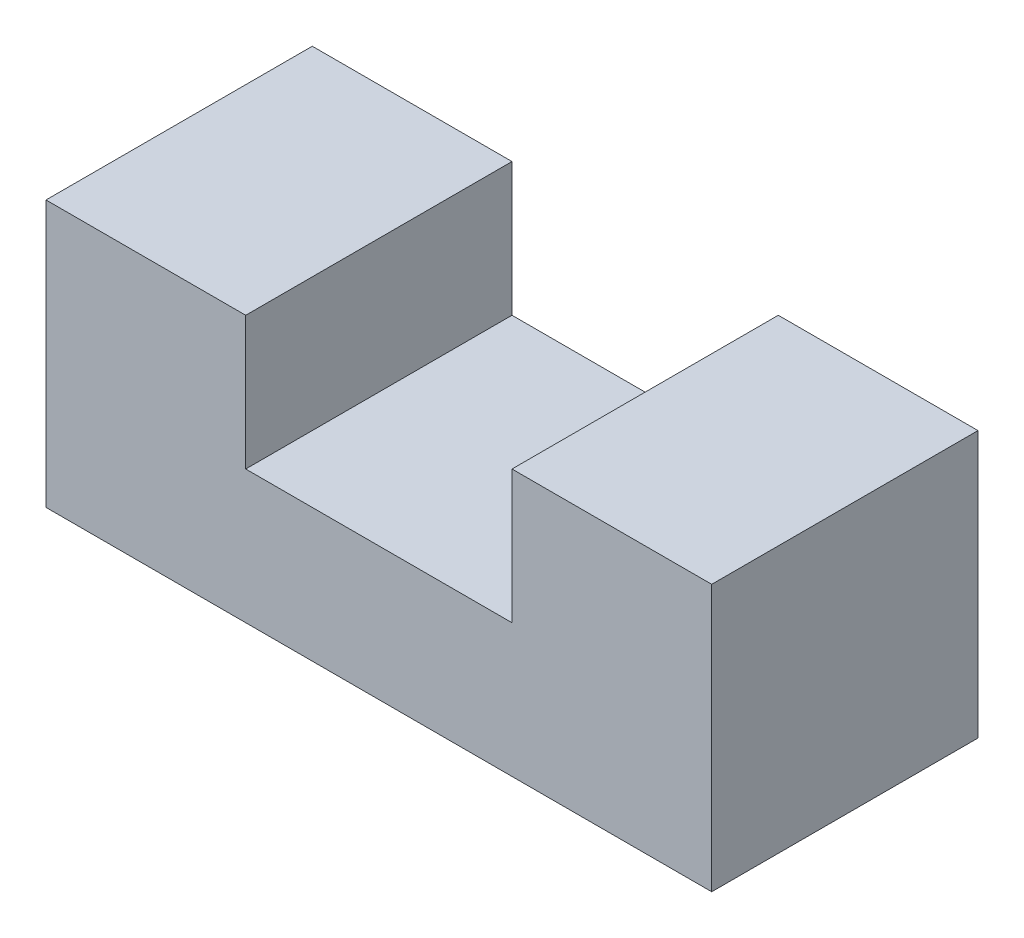
ISO-10303-21;
HEADER;
FILE_DESCRIPTION(('STEP AP214'),'2;1');
FILE_NAME('part.step','',(''),(''),'','','');
FILE_SCHEMA(('AUTOMOTIVE_DESIGN { 1 0 10303 214 1 1 1 1 }'));
ENDSEC;
DATA;
#1=APPLICATION_CONTEXT('core data for automotive mechanical design processes');
#2=APPLICATION_PROTOCOL_DEFINITION('international standard','automotive_design',2000,#1);
#3=PRODUCT_CONTEXT('',#1,'mechanical');
#4=PRODUCT('Part','Part','',(#3));
#5=PRODUCT_RELATED_PRODUCT_CATEGORY('part','',(#4));
#6=PRODUCT_DEFINITION_FORMATION('','',#4);
#7=PRODUCT_DEFINITION_CONTEXT('part definition',#1,'design');
#8=PRODUCT_DEFINITION('design','',#6,#7);
#9=PRODUCT_DEFINITION_SHAPE('','',#8);
#10=(LENGTH_UNIT() NAMED_UNIT(*) SI_UNIT(.MILLI.,.METRE.));
#11=(NAMED_UNIT(*) PLANE_ANGLE_UNIT() SI_UNIT($,.RADIAN.));
#12=(NAMED_UNIT(*) SI_UNIT($,.STERADIAN.) SOLID_ANGLE_UNIT());
#13=UNCERTAINTY_MEASURE_WITH_UNIT(LENGTH_MEASURE(1.E-05),#10,'distance_accuracy_value','');
#14=(GEOMETRIC_REPRESENTATION_CONTEXT(3) GLOBAL_UNCERTAINTY_ASSIGNED_CONTEXT((#13)) GLOBAL_UNIT_ASSIGNED_CONTEXT((#10,
#11,#12)) REPRESENTATION_CONTEXT('',''));
#15=CARTESIAN_POINT('',(0.,0.,0.));
#16=DIRECTION('',(0.,0.,1.));
#17=DIRECTION('',(1.,0.,0.));
#18=AXIS2_PLACEMENT_3D('',#15,#16,#17);
#19=CARTESIAN_POINT('',(0.,10.,20.));
#20=DIRECTION('',(0.,1.,0.));
#21=DIRECTION('',(0.,0.,1.));
#22=AXIS2_PLACEMENT_3D('',#19,#20,#21);
#23=PLANE('',#22);
#24=DIRECTION('',(1.,0.,0.));
#25=VECTOR('',#24,1.);
#26=CARTESIAN_POINT('',(0.,10.,0.));
#27=LINE('',#26,#25);
#28=CARTESIAN_POINT('',(9.99999999999999,10.,0.));
#29=VERTEX_POINT('',#28);
#30=CARTESIAN_POINT('',(25.,10.,0.));
#31=VERTEX_POINT('',#30);
#32=EDGE_CURVE('E141',#29,#31,#27,.T.);
#33=ORIENTED_EDGE('',*,*,#32,.F.);
#34=DIRECTION('',(0.,0.,-1.));
#35=VECTOR('',#34,1.);
#36=CARTESIAN_POINT('',(9.99999999999999,10.,20.));
#37=LINE('',#36,#35);
#38=CARTESIAN_POINT('',(9.99999999999999,10.,20.));
#39=VERTEX_POINT('',#38);
#40=EDGE_CURVE('E11',#39,#29,#37,.T.);
#41=ORIENTED_EDGE('',*,*,#40,.F.);
#42=DIRECTION('',(1.,0.,0.));
#43=VECTOR('',#42,1.);
#44=CARTESIAN_POINT('',(0.,10.,20.));
#45=LINE('',#44,#43);
#46=CARTESIAN_POINT('',(25.,10.,20.));
#47=VERTEX_POINT('',#46);
#48=EDGE_CURVE('E166',#39,#47,#45,.T.);
#49=ORIENTED_EDGE('',*,*,#48,.T.);
#50=DIRECTION('',(0.,0.,-1.));
#51=VECTOR('',#50,1.);
#52=CARTESIAN_POINT('',(25.,10.,20.));
#53=LINE('',#52,#51);
#54=EDGE_CURVE('E59',#47,#31,#53,.T.);
#55=ORIENTED_EDGE('',*,*,#54,.T.);
#56=EDGE_LOOP('',(#33,#41,#49,#55));
#57=FACE_BOUND('',#56,.T.);
#58=ADVANCED_FACE('F41',(#57),#23,.T.);
#59=CARTESIAN_POINT('',(10.,0.,20.));
#60=DIRECTION('',(1.,0.,0.));
#61=DIRECTION('',(0.,1.,0.));
#62=AXIS2_PLACEMENT_3D('',#59,#60,#61);
#63=PLANE('',#62);
#64=DIRECTION('',(0.,-1.,0.));
#65=VECTOR('',#64,1.);
#66=CARTESIAN_POINT('',(10.,0.,0.));
#67=LINE('',#66,#65);
#68=CARTESIAN_POINT('',(10.,0.,0.));
#69=VERTEX_POINT('',#68);
#70=EDGE_CURVE('E144',#29,#69,#67,.T.);
#71=ORIENTED_EDGE('',*,*,#70,.T.);
#72=DIRECTION('',(0.,0.,-1.));
#73=VECTOR('',#72,1.);
#74=CARTESIAN_POINT('',(10.,0.,20.));
#75=LINE('',#74,#73);
#76=CARTESIAN_POINT('',(10.,0.,20.));
#77=VERTEX_POINT('',#76);
#78=EDGE_CURVE('E51',#77,#69,#75,.T.);
#79=ORIENTED_EDGE('',*,*,#78,.F.);
#80=DIRECTION('',(0.,-1.,0.));
#81=VECTOR('',#80,1.);
#82=CARTESIAN_POINT('',(10.,0.,20.));
#83=LINE('',#82,#81);
#84=EDGE_CURVE('E197',#39,#77,#83,.T.);
#85=ORIENTED_EDGE('',*,*,#84,.F.);
#86=ORIENTED_EDGE('',*,*,#40,.T.);
#87=EDGE_LOOP('',(#71,#79,#85,#86));
#88=FACE_BOUND('',#87,.T.);
#89=ADVANCED_FACE('F43',(#88),#63,.F.);
#90=CARTESIAN_POINT('',(0.,0.,20.));
#91=DIRECTION('',(0.,1.,0.));
#92=DIRECTION('',(0.,0.,1.));
#93=AXIS2_PLACEMENT_3D('',#90,#91,#92);
#94=PLANE('',#93);
#95=DIRECTION('',(1.,0.,0.));
#96=VECTOR('',#95,1.);
#97=CARTESIAN_POINT('',(0.,0.,0.));
#98=LINE('',#97,#96);
#99=CARTESIAN_POINT('',(-10.,0.,0.));
#100=VERTEX_POINT('',#99);
#101=EDGE_CURVE('E149',#100,#69,#98,.T.);
#102=ORIENTED_EDGE('',*,*,#101,.F.);
#103=DIRECTION('',(0.,0.,-1.));
#104=VECTOR('',#103,1.);
#105=CARTESIAN_POINT('',(-10.,0.,20.));
#106=LINE('',#105,#104);
#107=CARTESIAN_POINT('',(-10.,0.,20.));
#108=VERTEX_POINT('',#107);
#109=EDGE_CURVE('E176',#108,#100,#106,.T.);
#110=ORIENTED_EDGE('',*,*,#109,.F.);
#111=DIRECTION('',(1.,0.,0.));
#112=VECTOR('',#111,1.);
#113=CARTESIAN_POINT('',(0.,0.,20.));
#114=LINE('',#113,#112);
#115=EDGE_CURVE('E185',#108,#77,#114,.T.);
#116=ORIENTED_EDGE('',*,*,#115,.T.);
#117=ORIENTED_EDGE('',*,*,#78,.T.);
#118=EDGE_LOOP('',(#102,#110,#116,#117));
#119=FACE_BOUND('',#118,.T.);
#120=ADVANCED_FACE('F183',(#119),#94,.T.);
#121=CARTESIAN_POINT('',(-10.,0.,20.));
#122=DIRECTION('',(1.,0.,0.));
#123=DIRECTION('',(0.,1.,0.));
#124=AXIS2_PLACEMENT_3D('',#121,#122,#123);
#125=PLANE('',#124);
#126=DIRECTION('',(0.,-1.,0.));
#127=VECTOR('',#126,1.);
#128=CARTESIAN_POINT('',(-10.,0.,0.));
#129=LINE('',#128,#127);
#130=CARTESIAN_POINT('',(-10.,10.,0.));
#131=VERTEX_POINT('',#130);
#132=EDGE_CURVE('E153',#131,#100,#129,.T.);
#133=ORIENTED_EDGE('',*,*,#132,.F.);
#134=DIRECTION('',(0.,0.,-1.));
#135=VECTOR('',#134,1.);
#136=CARTESIAN_POINT('',(-10.,10.,20.));
#137=LINE('',#136,#135);
#138=CARTESIAN_POINT('',(-10.,10.,20.));
#139=VERTEX_POINT('',#138);
#140=EDGE_CURVE('E173',#139,#131,#137,.T.);
#141=ORIENTED_EDGE('',*,*,#140,.F.);
#142=DIRECTION('',(0.,-1.,0.));
#143=VECTOR('',#142,1.);
#144=CARTESIAN_POINT('',(-10.,0.,20.));
#145=LINE('',#144,#143);
#146=EDGE_CURVE('E196',#139,#108,#145,.T.);
#147=ORIENTED_EDGE('',*,*,#146,.T.);
#148=ORIENTED_EDGE('',*,*,#109,.T.);
#149=EDGE_LOOP('',(#133,#141,#147,#148));
#150=FACE_BOUND('',#149,.T.);
#151=ADVANCED_FACE('F194',(#150),#125,.T.);
#152=CARTESIAN_POINT('',(-25.,10.,0.));
#153=VERTEX_POINT('',#152);
#154=EDGE_CURVE('E145',#153,#131,#27,.T.);
#155=ORIENTED_EDGE('',*,*,#154,.F.);
#156=DIRECTION('',(0.,0.,-1.));
#157=VECTOR('',#156,1.);
#158=CARTESIAN_POINT('',(-25.,10.,20.));
#159=LINE('',#158,#157);
#160=CARTESIAN_POINT('',(-25.,10.,20.));
#161=VERTEX_POINT('',#160);
#162=EDGE_CURVE('E131',#161,#153,#159,.T.);
#163=ORIENTED_EDGE('',*,*,#162,.F.);
#164=EDGE_CURVE('E119',#161,#139,#45,.T.);
#165=ORIENTED_EDGE('',*,*,#164,.T.);
#166=ORIENTED_EDGE('',*,*,#140,.T.);
#167=EDGE_LOOP('',(#155,#163,#165,#166));
#168=FACE_BOUND('',#167,.T.);
#169=ADVANCED_FACE('F207',(#168),#23,.T.);
#170=CARTESIAN_POINT('',(-25.,0.,20.));
#171=DIRECTION('',(1.,0.,0.));
#172=DIRECTION('',(0.,0.,-1.));
#173=AXIS2_PLACEMENT_3D('',#170,#171,#172);
#174=PLANE('',#173);
#175=DIRECTION('',(0.,-1.,0.));
#176=VECTOR('',#175,1.);
#177=CARTESIAN_POINT('',(-25.,0.,0.));
#178=LINE('',#177,#176);
#179=CARTESIAN_POINT('',(-25.,-10.,0.));
#180=VERTEX_POINT('',#179);
#181=EDGE_CURVE('E127',#153,#180,#178,.T.);
#182=ORIENTED_EDGE('',*,*,#181,.T.);
#183=DIRECTION('',(0.,0.,-1.));
#184=VECTOR('',#183,1.);
#185=CARTESIAN_POINT('',(-25.,-10.,20.));
#186=LINE('',#185,#184);
#187=CARTESIAN_POINT('',(-25.,-10.,20.));
#188=VERTEX_POINT('',#187);
#189=EDGE_CURVE('E124',#188,#180,#186,.T.);
#190=ORIENTED_EDGE('',*,*,#189,.F.);
#191=DIRECTION('',(0.,-1.,0.));
#192=VECTOR('',#191,1.);
#193=CARTESIAN_POINT('',(-25.,0.,20.));
#194=LINE('',#193,#192);
#195=EDGE_CURVE('E110',#161,#188,#194,.T.);
#196=ORIENTED_EDGE('',*,*,#195,.F.);
#197=ORIENTED_EDGE('',*,*,#162,.T.);
#198=EDGE_LOOP('',(#182,#190,#196,#197));
#199=FACE_BOUND('',#198,.T.);
#200=ADVANCED_FACE('F125',(#199),#174,.F.);
#201=CARTESIAN_POINT('',(0.,-10.,20.));
#202=DIRECTION('',(0.,1.,0.));
#203=DIRECTION('',(0.,0.,1.));
#204=AXIS2_PLACEMENT_3D('',#201,#202,#203);
#205=PLANE('',#204);
#206=DIRECTION('',(1.,0.,0.));
#207=VECTOR('',#206,1.);
#208=CARTESIAN_POINT('',(0.,-10.,0.));
#209=LINE('',#208,#207);
#210=CARTESIAN_POINT('',(25.,-10.,0.));
#211=VERTEX_POINT('',#210);
#212=EDGE_CURVE('E159',#180,#211,#209,.T.);
#213=ORIENTED_EDGE('',*,*,#212,.T.);
#214=DIRECTION('',(0.,0.,-1.));
#215=VECTOR('',#214,1.);
#216=CARTESIAN_POINT('',(25.,-10.,20.));
#217=LINE('',#216,#215);
#218=CARTESIAN_POINT('',(25.,-10.,20.));
#219=VERTEX_POINT('',#218);
#220=EDGE_CURVE('E85',#219,#211,#217,.T.);
#221=ORIENTED_EDGE('',*,*,#220,.F.);
#222=DIRECTION('',(1.,0.,0.));
#223=VECTOR('',#222,1.);
#224=CARTESIAN_POINT('',(0.,-10.,20.));
#225=LINE('',#224,#223);
#226=EDGE_CURVE('E116',#188,#219,#225,.T.);
#227=ORIENTED_EDGE('',*,*,#226,.F.);
#228=ORIENTED_EDGE('',*,*,#189,.T.);
#229=EDGE_LOOP('',(#213,#221,#227,#228));
#230=FACE_BOUND('',#229,.T.);
#231=ADVANCED_FACE('F133',(#230),#205,.F.);
#232=CARTESIAN_POINT('',(25.,0.,20.));
#233=DIRECTION('',(1.,0.,0.));
#234=DIRECTION('',(0.,0.,-1.));
#235=AXIS2_PLACEMENT_3D('',#232,#233,#234);
#236=PLANE('',#235);
#237=DIRECTION('',(0.,-1.,0.));
#238=VECTOR('',#237,1.);
#239=CARTESIAN_POINT('',(25.,0.,0.));
#240=LINE('',#239,#238);
#241=EDGE_CURVE('E162',#31,#211,#240,.T.);
#242=ORIENTED_EDGE('',*,*,#241,.F.);
#243=ORIENTED_EDGE('',*,*,#54,.F.);
#244=DIRECTION('',(0.,-1.,0.));
#245=VECTOR('',#244,1.);
#246=CARTESIAN_POINT('',(25.,0.,20.));
#247=LINE('',#246,#245);
#248=EDGE_CURVE('E135',#47,#219,#247,.T.);
#249=ORIENTED_EDGE('',*,*,#248,.T.);
#250=ORIENTED_EDGE('',*,*,#220,.T.);
#251=EDGE_LOOP('',(#242,#243,#249,#250));
#252=FACE_BOUND('',#251,.T.);
#253=ADVANCED_FACE('F208',(#252),#236,.T.);
#254=CARTESIAN_POINT('',(0.,0.,20.));
#255=DIRECTION('',(0.,0.,1.));
#256=DIRECTION('',(1.,0.,0.));
#257=AXIS2_PLACEMENT_3D('',#254,#255,#256);
#258=PLANE('',#257);
#259=ORIENTED_EDGE('',*,*,#48,.F.);
#260=ORIENTED_EDGE('',*,*,#84,.T.);
#261=ORIENTED_EDGE('',*,*,#115,.F.);
#262=ORIENTED_EDGE('',*,*,#146,.F.);
#263=ORIENTED_EDGE('',*,*,#164,.F.);
#264=ORIENTED_EDGE('',*,*,#195,.T.);
#265=ORIENTED_EDGE('',*,*,#226,.T.);
#266=ORIENTED_EDGE('',*,*,#248,.F.);
#267=EDGE_LOOP('',(#259,#260,#261,#262,#263,#264,#265,#266));
#268=FACE_BOUND('',#267,.T.);
#269=ADVANCED_FACE('F113',(#268),#258,.T.);
#270=CARTESIAN_POINT('',(0.,0.,0.));
#271=DIRECTION('',(0.,0.,1.));
#272=DIRECTION('',(1.,0.,0.));
#273=AXIS2_PLACEMENT_3D('',#270,#271,#272);
#274=PLANE('',#273);
#275=ORIENTED_EDGE('',*,*,#32,.T.);
#276=ORIENTED_EDGE('',*,*,#241,.T.);
#277=ORIENTED_EDGE('',*,*,#212,.F.);
#278=ORIENTED_EDGE('',*,*,#181,.F.);
#279=ORIENTED_EDGE('',*,*,#154,.T.);
#280=ORIENTED_EDGE('',*,*,#132,.T.);
#281=ORIENTED_EDGE('',*,*,#101,.T.);
#282=ORIENTED_EDGE('',*,*,#70,.F.);
#283=EDGE_LOOP('',(#275,#276,#277,#278,#279,#280,#281,#282));
#284=FACE_BOUND('',#283,.T.);
#285=ADVANCED_FACE('F189',(#284),#274,.F.);
#286=CLOSED_SHELL('',(#58,#89,#120,#151,#169,#200,#231,#253,#269,#285));
#287=MANIFOLD_SOLID_BREP('B2',#286);
#288=ADVANCED_BREP_SHAPE_REPRESENTATION('',(#18,#287),#14);
#289=SHAPE_DEFINITION_REPRESENTATION(#9,#288);
ENDSEC;
END-ISO-10303-21;
